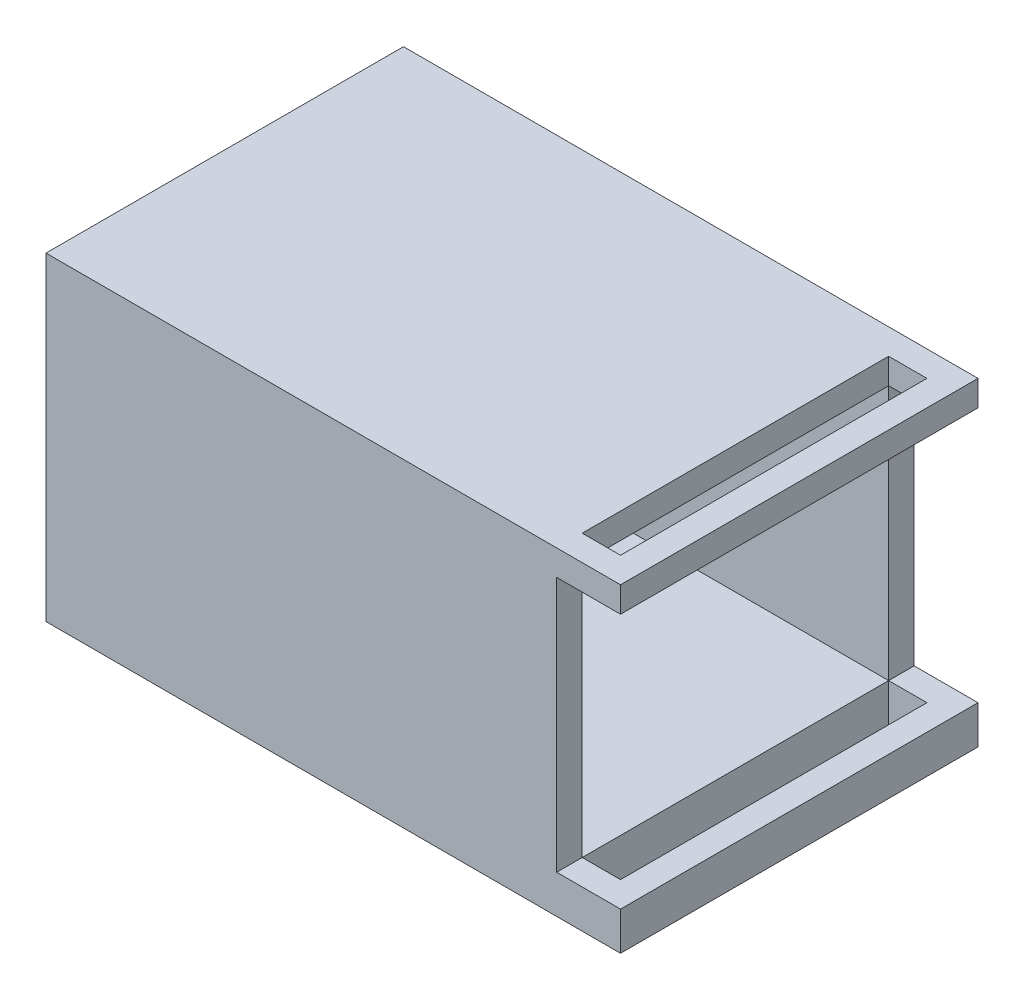
ISO-10303-21;
HEADER;
FILE_DESCRIPTION(('STEP AP214'),'2;1');
FILE_NAME('part.step','',(''),(''),'','','');
FILE_SCHEMA(('AUTOMOTIVE_DESIGN { 1 0 10303 214 1 1 1 1 }'));
ENDSEC;
DATA;
#1=APPLICATION_CONTEXT('core data for automotive mechanical design processes');
#2=APPLICATION_PROTOCOL_DEFINITION('international standard','automotive_design',2000,#1);
#3=PRODUCT_CONTEXT('',#1,'mechanical');
#4=PRODUCT('Part','Part','',(#3));
#5=PRODUCT_RELATED_PRODUCT_CATEGORY('part','',(#4));
#6=PRODUCT_DEFINITION_FORMATION('','',#4);
#7=PRODUCT_DEFINITION_CONTEXT('part definition',#1,'design');
#8=PRODUCT_DEFINITION('design','',#6,#7);
#9=PRODUCT_DEFINITION_SHAPE('','',#8);
#10=(LENGTH_UNIT() NAMED_UNIT(*) SI_UNIT(.MILLI.,.METRE.));
#11=(NAMED_UNIT(*) PLANE_ANGLE_UNIT() SI_UNIT($,.RADIAN.));
#12=(NAMED_UNIT(*) SI_UNIT($,.STERADIAN.) SOLID_ANGLE_UNIT());
#13=UNCERTAINTY_MEASURE_WITH_UNIT(LENGTH_MEASURE(1.E-05),#10,'distance_accuracy_value','');
#14=(GEOMETRIC_REPRESENTATION_CONTEXT(3) GLOBAL_UNCERTAINTY_ASSIGNED_CONTEXT((#13)) GLOBAL_UNIT_ASSIGNED_CONTEXT((#10,
#11,#12)) REPRESENTATION_CONTEXT('',''));
#15=CARTESIAN_POINT('',(0.,0.,0.));
#16=DIRECTION('',(0.,0.,1.));
#17=DIRECTION('',(1.,0.,0.));
#18=AXIS2_PLACEMENT_3D('',#15,#16,#17);
#19=CARTESIAN_POINT('',(0.,3.,0.));
#20=DIRECTION('',(0.,1.,0.));
#21=DIRECTION('',(0.,0.,1.));
#22=AXIS2_PLACEMENT_3D('',#19,#20,#21);
#23=PLANE('',#22);
#24=DIRECTION('',(0.,0.,-1.));
#25=VECTOR('',#24,1.);
#26=CARTESIAN_POINT('',(43.,3.,-2.));
#27=LINE('',#26,#25);
#28=CARTESIAN_POINT('',(43.,3.,-2.));
#29=VERTEX_POINT('',#28);
#30=CARTESIAN_POINT('',(43.,3.,-26.));
#31=VERTEX_POINT('',#30);
#32=EDGE_CURVE('E56',#29,#31,#27,.T.);
#33=ORIENTED_EDGE('',*,*,#32,.F.);
#34=DIRECTION('',(1.,0.,0.));
#35=VECTOR('',#34,1.);
#36=CARTESIAN_POINT('',(43.,3.,-2.));
#37=LINE('',#36,#35);
#38=CARTESIAN_POINT('',(40.,3.,-2.));
#39=VERTEX_POINT('',#38);
#40=EDGE_CURVE('E255',#39,#29,#37,.T.);
#41=ORIENTED_EDGE('',*,*,#40,.F.);
#42=DIRECTION('',(0.,0.,1.));
#43=VECTOR('',#42,1.);
#44=CARTESIAN_POINT('',(40.,3.,-2.));
#45=LINE('',#44,#43);
#46=CARTESIAN_POINT('',(40.,3.,0.));
#47=VERTEX_POINT('',#46);
#48=EDGE_CURVE('E443',#39,#47,#45,.T.);
#49=ORIENTED_EDGE('',*,*,#48,.T.);
#50=DIRECTION('',(1.,0.,0.));
#51=VECTOR('',#50,1.);
#52=CARTESIAN_POINT('',(0.,3.,0.));
#53=LINE('',#52,#51);
#54=CARTESIAN_POINT('',(45.,3.,0.));
#55=VERTEX_POINT('',#54);
#56=EDGE_CURVE('E471',#47,#55,#53,.T.);
#57=ORIENTED_EDGE('',*,*,#56,.T.);
#58=DIRECTION('',(0.,0.,-1.));
#59=VECTOR('',#58,1.);
#60=CARTESIAN_POINT('',(45.,3.,0.));
#61=LINE('',#60,#59);
#62=CARTESIAN_POINT('',(45.,3.,-28.));
#63=VERTEX_POINT('',#62);
#64=EDGE_CURVE('E467',#55,#63,#61,.T.);
#65=ORIENTED_EDGE('',*,*,#64,.T.);
#66=DIRECTION('',(1.,0.,0.));
#67=VECTOR('',#66,1.);
#68=CARTESIAN_POINT('',(0.,3.,-28.));
#69=LINE('',#68,#67);
#70=CARTESIAN_POINT('',(40.,3.,-28.));
#71=VERTEX_POINT('',#70);
#72=EDGE_CURVE('E465',#71,#63,#69,.T.);
#73=ORIENTED_EDGE('',*,*,#72,.F.);
#74=DIRECTION('',(0.,0.,-1.));
#75=VECTOR('',#74,1.);
#76=CARTESIAN_POINT('',(40.,3.,-26.));
#77=LINE('',#76,#75);
#78=CARTESIAN_POINT('',(40.,3.,-26.));
#79=VERTEX_POINT('',#78);
#80=EDGE_CURVE('E446',#79,#71,#77,.T.);
#81=ORIENTED_EDGE('',*,*,#80,.F.);
#82=DIRECTION('',(-1.,0.,0.));
#83=VECTOR('',#82,1.);
#84=CARTESIAN_POINT('',(43.,3.,-26.));
#85=LINE('',#84,#83);
#86=EDGE_CURVE('E264',#31,#79,#85,.T.);
#87=ORIENTED_EDGE('',*,*,#86,.F.);
#88=EDGE_LOOP('',(#33,#41,#49,#57,#65,#73,#81,#87));
#89=FACE_BOUND('',#88,.T.);
#90=ADVANCED_FACE('F41',(#89),#23,.T.);
#91=CARTESIAN_POINT('',(2.,25.,-26.));
#92=DIRECTION('',(1.,0.,0.));
#93=DIRECTION('',(0.,0.,-1.));
#94=AXIS2_PLACEMENT_3D('',#91,#92,#93);
#95=PLANE('',#94);
#96=CARTESIAN_POINT('',(2.,5.25,-17.47));
#97=DIRECTION('',(-1.,0.,0.));
#98=DIRECTION('',(0.,0.,1.));
#99=AXIS2_PLACEMENT_3D('',#96,#97,#98);
#100=CIRCLE('',#99,1.25);
#101=CARTESIAN_POINT('',(2.,5.25,-18.72));
#102=VERTEX_POINT('',#101);
#103=CARTESIAN_POINT('',(2.,4.,-17.47));
#104=VERTEX_POINT('',#103);
#105=EDGE_CURVE('E274',#102,#104,#100,.T.);
#106=ORIENTED_EDGE('',*,*,#105,.T.);
#107=DIRECTION('',(0.,0.,1.));
#108=VECTOR('',#107,1.);
#109=CARTESIAN_POINT('',(2.,4.,-17.47));
#110=LINE('',#109,#108);
#111=CARTESIAN_POINT('',(2.,4.,-10.53));
#112=VERTEX_POINT('',#111);
#113=EDGE_CURVE('E277',#104,#112,#110,.T.);
#114=ORIENTED_EDGE('',*,*,#113,.T.);
#115=CARTESIAN_POINT('',(2.,5.25,-10.53));
#116=DIRECTION('',(-1.,0.,0.));
#117=DIRECTION('',(0.,0.,1.));
#118=AXIS2_PLACEMENT_3D('',#115,#116,#117);
#119=CIRCLE('',#118,1.25);
#120=CARTESIAN_POINT('',(2.,5.25,-9.28));
#121=VERTEX_POINT('',#120);
#122=EDGE_CURVE('E281',#112,#121,#119,.T.);
#123=ORIENTED_EDGE('',*,*,#122,.T.);
#124=DIRECTION('',(0.,1.,0.));
#125=VECTOR('',#124,1.);
#126=CARTESIAN_POINT('',(2.,5.96,-9.28));
#127=LINE('',#126,#125);
#128=CARTESIAN_POINT('',(2.,5.96,-9.28));
#129=VERTEX_POINT('',#128);
#130=EDGE_CURVE('E284',#121,#129,#127,.T.);
#131=ORIENTED_EDGE('',*,*,#130,.T.);
#132=CARTESIAN_POINT('',(2.,5.96,-10.53));
#133=DIRECTION('',(-1.,0.,0.));
#134=DIRECTION('',(0.,0.,1.));
#135=AXIS2_PLACEMENT_3D('',#132,#133,#134);
#136=CIRCLE('',#135,1.25);
#137=CARTESIAN_POINT('',(2.,7.21,-10.53));
#138=VERTEX_POINT('',#137);
#139=EDGE_CURVE('E287',#129,#138,#136,.T.);
#140=ORIENTED_EDGE('',*,*,#139,.T.);
#141=DIRECTION('',(0.,0.,-1.));
#142=VECTOR('',#141,1.);
#143=CARTESIAN_POINT('',(2.,7.21,-17.47));
#144=LINE('',#143,#142);
#145=CARTESIAN_POINT('',(2.,7.21,-17.47));
#146=VERTEX_POINT('',#145);
#147=EDGE_CURVE('E290',#138,#146,#144,.T.);
#148=ORIENTED_EDGE('',*,*,#147,.T.);
#149=CARTESIAN_POINT('',(2.,5.96,-17.47));
#150=DIRECTION('',(-1.,0.,0.));
#151=DIRECTION('',(0.,0.,1.));
#152=AXIS2_PLACEMENT_3D('',#149,#150,#151);
#153=CIRCLE('',#152,1.25);
#154=CARTESIAN_POINT('',(2.,5.96,-18.72));
#155=VERTEX_POINT('',#154);
#156=EDGE_CURVE('E293',#146,#155,#153,.T.);
#157=ORIENTED_EDGE('',*,*,#156,.T.);
#158=DIRECTION('',(0.,-1.,0.));
#159=VECTOR('',#158,1.);
#160=CARTESIAN_POINT('',(2.,5.25,-18.72));
#161=LINE('',#160,#159);
#162=EDGE_CURVE('E296',#155,#102,#161,.T.);
#163=ORIENTED_EDGE('',*,*,#162,.T.);
#164=EDGE_LOOP('',(#106,#114,#123,#131,#140,#148,#157,#163));
#165=FACE_BOUND('',#164,.T.);
#166=DIRECTION('',(0.,-1.,0.));
#167=VECTOR('',#166,1.);
#168=CARTESIAN_POINT('',(2.,12.,-18.5));
#169=LINE('',#168,#167);
#170=CARTESIAN_POINT('',(2.,12.,-18.5));
#171=VERTEX_POINT('',#170);
#172=CARTESIAN_POINT('',(2.,8.5,-18.5));
#173=VERTEX_POINT('',#172);
#174=EDGE_CURVE('E353',#171,#173,#169,.T.);
#175=ORIENTED_EDGE('',*,*,#174,.T.);
#176=DIRECTION('',(0.,0.,1.));
#177=VECTOR('',#176,1.);
#178=CARTESIAN_POINT('',(2.,8.5,-18.5));
#179=LINE('',#178,#177);
#180=CARTESIAN_POINT('',(2.,8.5,-9.50000000000001));
#181=VERTEX_POINT('',#180);
#182=EDGE_CURVE('E365',#173,#181,#179,.T.);
#183=ORIENTED_EDGE('',*,*,#182,.T.);
#184=DIRECTION('',(0.,1.,0.));
#185=VECTOR('',#184,1.);
#186=CARTESIAN_POINT('',(2.,12.,-9.5));
#187=LINE('',#186,#185);
#188=CARTESIAN_POINT('',(2.,12.,-9.5));
#189=VERTEX_POINT('',#188);
#190=EDGE_CURVE('E362',#181,#189,#187,.T.);
#191=ORIENTED_EDGE('',*,*,#190,.T.);
#192=DIRECTION('',(0.,0.,-1.));
#193=VECTOR('',#192,1.);
#194=CARTESIAN_POINT('',(2.,12.,-18.5));
#195=LINE('',#194,#193);
#196=EDGE_CURVE('E343',#189,#171,#195,.T.);
#197=ORIENTED_EDGE('',*,*,#196,.T.);
#198=EDGE_LOOP('',(#175,#183,#191,#197));
#199=FACE_BOUND('',#198,.T.);
#200=DIRECTION('',(0.,-1.,0.));
#201=VECTOR('',#200,1.);
#202=CARTESIAN_POINT('',(2.,25.,-26.));
#203=LINE('',#202,#201);
#204=CARTESIAN_POINT('',(2.,23.,-26.));
#205=VERTEX_POINT('',#204);
#206=CARTESIAN_POINT('',(2.,3.,-26.));
#207=VERTEX_POINT('',#206);
#208=EDGE_CURVE('E451',#205,#207,#203,.T.);
#209=ORIENTED_EDGE('',*,*,#208,.F.);
#210=DIRECTION('',(0.,0.,1.));
#211=VECTOR('',#210,1.);
#212=CARTESIAN_POINT('',(2.,23.,-26.));
#213=LINE('',#212,#211);
#214=CARTESIAN_POINT('',(2.,23.,-2.));
#215=VERTEX_POINT('',#214);
#216=EDGE_CURVE('E420',#205,#215,#213,.T.);
#217=ORIENTED_EDGE('',*,*,#216,.T.);
#218=DIRECTION('',(0.,-1.,0.));
#219=VECTOR('',#218,1.);
#220=CARTESIAN_POINT('',(2.,25.,-2.));
#221=LINE('',#220,#219);
#222=CARTESIAN_POINT('',(2.,3.,-2.));
#223=VERTEX_POINT('',#222);
#224=EDGE_CURVE('E437',#215,#223,#221,.T.);
#225=ORIENTED_EDGE('',*,*,#224,.T.);
#226=DIRECTION('',(0.,0.,1.));
#227=VECTOR('',#226,1.);
#228=CARTESIAN_POINT('',(2.,3.,-26.));
#229=LINE('',#228,#227);
#230=EDGE_CURVE('E428',#207,#223,#229,.T.);
#231=ORIENTED_EDGE('',*,*,#230,.F.);
#232=EDGE_LOOP('',(#209,#217,#225,#231));
#233=FACE_BOUND('',#232,.T.);
#234=ADVANCED_FACE('F563',(#165,#199,#233),#95,.T.);
#235=CARTESIAN_POINT('',(2.,25.,-26.));
#236=DIRECTION('',(0.,0.,-1.));
#237=DIRECTION('',(-1.,0.,0.));
#238=AXIS2_PLACEMENT_3D('',#235,#236,#237);
#239=PLANE('',#238);
#240=DIRECTION('',(1.,0.,0.));
#241=VECTOR('',#240,1.);
#242=CARTESIAN_POINT('',(2.,23.,-26.));
#243=LINE('',#242,#241);
#244=CARTESIAN_POINT('',(40.,23.,-26.));
#245=VERTEX_POINT('',#244);
#246=EDGE_CURVE('E422',#205,#245,#243,.T.);
#247=ORIENTED_EDGE('',*,*,#246,.F.);
#248=ORIENTED_EDGE('',*,*,#208,.T.);
#249=DIRECTION('',(1.,0.,0.));
#250=VECTOR('',#249,1.);
#251=CARTESIAN_POINT('',(2.,3.,-26.));
#252=LINE('',#251,#250);
#253=EDGE_CURVE('E432',#207,#79,#252,.T.);
#254=ORIENTED_EDGE('',*,*,#253,.T.);
#255=DIRECTION('',(0.,-1.,0.));
#256=VECTOR('',#255,1.);
#257=CARTESIAN_POINT('',(40.,25.,-26.));
#258=LINE('',#257,#256);
#259=EDGE_CURVE('E454',#245,#79,#258,.T.);
#260=ORIENTED_EDGE('',*,*,#259,.F.);
#261=EDGE_LOOP('',(#247,#248,#254,#260));
#262=FACE_BOUND('',#261,.T.);
#263=ADVANCED_FACE('F525',(#262),#239,.F.);
#264=CARTESIAN_POINT('',(40.,25.,-26.));
#265=DIRECTION('',(-1.,0.,0.));
#266=DIRECTION('',(0.,0.,1.));
#267=AXIS2_PLACEMENT_3D('',#264,#265,#266);
#268=PLANE('',#267);
#269=DIRECTION('',(0.,0.,-1.));
#270=VECTOR('',#269,1.);
#271=CARTESIAN_POINT('',(40.,23.,-26.));
#272=LINE('',#271,#270);
#273=CARTESIAN_POINT('',(40.,23.,-28.));
#274=VERTEX_POINT('',#273);
#275=EDGE_CURVE('E425',#245,#274,#272,.T.);
#276=ORIENTED_EDGE('',*,*,#275,.F.);
#277=ORIENTED_EDGE('',*,*,#259,.T.);
#278=ORIENTED_EDGE('',*,*,#80,.T.);
#279=DIRECTION('',(0.,-1.,0.));
#280=VECTOR('',#279,1.);
#281=CARTESIAN_POINT('',(40.,25.,-28.));
#282=LINE('',#281,#280);
#283=EDGE_CURVE('E457',#274,#71,#282,.T.);
#284=ORIENTED_EDGE('',*,*,#283,.F.);
#285=EDGE_LOOP('',(#276,#277,#278,#284));
#286=FACE_BOUND('',#285,.T.);
#287=ADVANCED_FACE('F522',(#286),#268,.F.);
#288=CARTESIAN_POINT('',(40.,25.,-2.));
#289=DIRECTION('',(1.,0.,0.));
#290=DIRECTION('',(0.,0.,-1.));
#291=AXIS2_PLACEMENT_3D('',#288,#289,#290);
#292=PLANE('',#291);
#293=DIRECTION('',(0.,-1.,0.));
#294=VECTOR('',#293,1.);
#295=CARTESIAN_POINT('',(40.,25.,-2.));
#296=LINE('',#295,#294);
#297=CARTESIAN_POINT('',(40.,23.,-2.));
#298=VERTEX_POINT('',#297);
#299=EDGE_CURVE('E461',#298,#39,#296,.T.);
#300=ORIENTED_EDGE('',*,*,#299,.F.);
#301=DIRECTION('',(0.,0.,1.));
#302=VECTOR('',#301,1.);
#303=CARTESIAN_POINT('',(40.,23.,-2.));
#304=LINE('',#303,#302);
#305=CARTESIAN_POINT('',(40.,23.,0.));
#306=VERTEX_POINT('',#305);
#307=EDGE_CURVE('E416',#298,#306,#304,.T.);
#308=ORIENTED_EDGE('',*,*,#307,.T.);
#309=DIRECTION('',(0.,-1.,0.));
#310=VECTOR('',#309,1.);
#311=CARTESIAN_POINT('',(40.,25.,0.));
#312=LINE('',#311,#310);
#313=EDGE_CURVE('E459',#306,#47,#312,.T.);
#314=ORIENTED_EDGE('',*,*,#313,.T.);
#315=ORIENTED_EDGE('',*,*,#48,.F.);
#316=EDGE_LOOP('',(#300,#308,#314,#315));
#317=FACE_BOUND('',#316,.T.);
#318=ADVANCED_FACE('F580',(#317),#292,.T.);
#319=CARTESIAN_POINT('',(2.,25.,-2.));
#320=DIRECTION('',(0.,0.,-1.));
#321=DIRECTION('',(-1.,0.,0.));
#322=AXIS2_PLACEMENT_3D('',#319,#320,#321);
#323=PLANE('',#322);
#324=ORIENTED_EDGE('',*,*,#224,.F.);
#325=DIRECTION('',(1.,0.,0.));
#326=VECTOR('',#325,1.);
#327=CARTESIAN_POINT('',(2.,23.,-2.));
#328=LINE('',#327,#326);
#329=EDGE_CURVE('E11',#215,#298,#328,.T.);
#330=ORIENTED_EDGE('',*,*,#329,.T.);
#331=ORIENTED_EDGE('',*,*,#299,.T.);
#332=DIRECTION('',(1.,0.,0.));
#333=VECTOR('',#332,1.);
#334=CARTESIAN_POINT('',(2.,3.,-2.));
#335=LINE('',#334,#333);
#336=EDGE_CURVE('E440',#223,#39,#335,.T.);
#337=ORIENTED_EDGE('',*,*,#336,.F.);
#338=EDGE_LOOP('',(#324,#330,#331,#337));
#339=FACE_BOUND('',#338,.T.);
#340=ADVANCED_FACE('F574',(#339),#323,.T.);
#341=DIRECTION('',(0.,0.,1.));
#342=VECTOR('',#341,1.);
#343=CARTESIAN_POINT('',(40.,3.,-2.));
#344=LINE('',#343,#342);
#345=EDGE_CURVE('E258',#79,#39,#344,.T.);
#346=ORIENTED_EDGE('',*,*,#345,.F.);
#347=ORIENTED_EDGE('',*,*,#253,.F.);
#348=ORIENTED_EDGE('',*,*,#230,.T.);
#349=ORIENTED_EDGE('',*,*,#336,.T.);
#350=EDGE_LOOP('',(#346,#347,#348,#349));
#351=FACE_BOUND('',#350,.T.);
#352=ADVANCED_FACE('F565',(#351),#23,.T.);
#353=CARTESIAN_POINT('',(0.,3.,-28.));
#354=DIRECTION('',(0.,0.,-1.));
#355=DIRECTION('',(-1.,0.,0.));
#356=AXIS2_PLACEMENT_3D('',#353,#354,#355);
#357=PLANE('',#356);
#358=DIRECTION('',(-1.,0.,0.));
#359=VECTOR('',#358,1.);
#360=CARTESIAN_POINT('',(0.,23.,-28.));
#361=LINE('',#360,#359);
#362=CARTESIAN_POINT('',(45.,23.,-28.));
#363=VERTEX_POINT('',#362);
#364=EDGE_CURVE('E407',#363,#274,#361,.T.);
#365=ORIENTED_EDGE('',*,*,#364,.T.);
#366=ORIENTED_EDGE('',*,*,#283,.T.);
#367=ORIENTED_EDGE('',*,*,#72,.T.);
#368=DIRECTION('',(0.,-1.,0.));
#369=VECTOR('',#368,1.);
#370=CARTESIAN_POINT('',(45.,3.,-28.));
#371=LINE('',#370,#369);
#372=CARTESIAN_POINT('',(45.,0.,-28.));
#373=VERTEX_POINT('',#372);
#374=EDGE_CURVE('E473',#63,#373,#371,.T.);
#375=ORIENTED_EDGE('',*,*,#374,.T.);
#376=DIRECTION('',(1.,0.,0.));
#377=VECTOR('',#376,1.);
#378=CARTESIAN_POINT('',(0.,0.,-28.));
#379=LINE('',#378,#377);
#380=CARTESIAN_POINT('',(0.,0.,-28.));
#381=VERTEX_POINT('',#380);
#382=EDGE_CURVE('E453',#381,#373,#379,.T.);
#383=ORIENTED_EDGE('',*,*,#382,.F.);
#384=DIRECTION('',(0.,-1.,0.));
#385=VECTOR('',#384,1.);
#386=CARTESIAN_POINT('',(0.,3.,-28.));
#387=LINE('',#386,#385);
#388=CARTESIAN_POINT('',(0.,25.,-28.));
#389=VERTEX_POINT('',#388);
#390=EDGE_CURVE('E49',#389,#381,#387,.T.);
#391=ORIENTED_EDGE('',*,*,#390,.F.);
#392=DIRECTION('',(1.,0.,0.));
#393=VECTOR('',#392,1.);
#394=CARTESIAN_POINT('',(0.,25.,-28.));
#395=LINE('',#394,#393);
#396=CARTESIAN_POINT('',(45.,25.,-28.));
#397=VERTEX_POINT('',#396);
#398=EDGE_CURVE('E435',#389,#397,#395,.T.);
#399=ORIENTED_EDGE('',*,*,#398,.T.);
#400=DIRECTION('',(0.,1.,0.));
#401=VECTOR('',#400,1.);
#402=CARTESIAN_POINT('',(45.,23.,-28.));
#403=LINE('',#402,#401);
#404=EDGE_CURVE('E413',#363,#397,#403,.T.);
#405=ORIENTED_EDGE('',*,*,#404,.F.);
#406=EDGE_LOOP('',(#365,#366,#367,#375,#383,#391,#399,#405));
#407=FACE_BOUND('',#406,.T.);
#408=ADVANCED_FACE('F43',(#407),#357,.T.);
#409=CARTESIAN_POINT('',(0.,3.,0.));
#410=DIRECTION('',(-1.,0.,0.));
#411=DIRECTION('',(0.,0.,1.));
#412=AXIS2_PLACEMENT_3D('',#409,#410,#411);
#413=PLANE('',#412);
#414=CARTESIAN_POINT('',(0.,5.25,-17.47));
#415=DIRECTION('',(-1.,0.,0.));
#416=DIRECTION('',(0.,0.,1.));
#417=AXIS2_PLACEMENT_3D('',#414,#415,#416);
#418=CIRCLE('',#417,1.25);
#419=CARTESIAN_POINT('',(0.,5.25,-18.72));
#420=VERTEX_POINT('',#419);
#421=CARTESIAN_POINT('',(0.,4.,-17.47));
#422=VERTEX_POINT('',#421);
#423=EDGE_CURVE('E300',#420,#422,#418,.T.);
#424=ORIENTED_EDGE('',*,*,#423,.F.);
#425=DIRECTION('',(0.,-1.,0.));
#426=VECTOR('',#425,1.);
#427=CARTESIAN_POINT('',(0.,5.25,-18.72));
#428=LINE('',#427,#426);
#429=CARTESIAN_POINT('',(0.,5.96,-18.72));
#430=VERTEX_POINT('',#429);
#431=EDGE_CURVE('E278',#430,#420,#428,.T.);
#432=ORIENTED_EDGE('',*,*,#431,.F.);
#433=CARTESIAN_POINT('',(0.,5.96,-17.47));
#434=DIRECTION('',(-1.,0.,0.));
#435=DIRECTION('',(0.,0.,1.));
#436=AXIS2_PLACEMENT_3D('',#433,#434,#435);
#437=CIRCLE('',#436,1.25);
#438=CARTESIAN_POINT('',(0.,7.21,-17.47));
#439=VERTEX_POINT('',#438);
#440=EDGE_CURVE('E318',#439,#430,#437,.T.);
#441=ORIENTED_EDGE('',*,*,#440,.F.);
#442=DIRECTION('',(0.,0.,-1.));
#443=VECTOR('',#442,1.);
#444=CARTESIAN_POINT('',(0.,7.21,-17.47));
#445=LINE('',#444,#443);
#446=CARTESIAN_POINT('',(0.,7.21,-10.53));
#447=VERTEX_POINT('',#446);
#448=EDGE_CURVE('E315',#447,#439,#445,.T.);
#449=ORIENTED_EDGE('',*,*,#448,.F.);
#450=CARTESIAN_POINT('',(0.,5.96,-10.53));
#451=DIRECTION('',(-1.,0.,0.));
#452=DIRECTION('',(0.,0.,1.));
#453=AXIS2_PLACEMENT_3D('',#450,#451,#452);
#454=CIRCLE('',#453,1.25);
#455=CARTESIAN_POINT('',(0.,5.96,-9.28));
#456=VERTEX_POINT('',#455);
#457=EDGE_CURVE('E312',#456,#447,#454,.T.);
#458=ORIENTED_EDGE('',*,*,#457,.F.);
#459=DIRECTION('',(0.,1.,0.));
#460=VECTOR('',#459,1.);
#461=CARTESIAN_POINT('',(0.,5.96,-9.28));
#462=LINE('',#461,#460);
#463=CARTESIAN_POINT('',(0.,5.25,-9.28));
#464=VERTEX_POINT('',#463);
#465=EDGE_CURVE('E309',#464,#456,#462,.T.);
#466=ORIENTED_EDGE('',*,*,#465,.F.);
#467=CARTESIAN_POINT('',(0.,5.25,-10.53));
#468=DIRECTION('',(-1.,0.,0.));
#469=DIRECTION('',(0.,0.,1.));
#470=AXIS2_PLACEMENT_3D('',#467,#468,#469);
#471=CIRCLE('',#470,1.25);
#472=CARTESIAN_POINT('',(0.,4.,-10.53));
#473=VERTEX_POINT('',#472);
#474=EDGE_CURVE('E306',#473,#464,#471,.T.);
#475=ORIENTED_EDGE('',*,*,#474,.F.);
#476=DIRECTION('',(0.,0.,1.));
#477=VECTOR('',#476,1.);
#478=CARTESIAN_POINT('',(0.,4.,-17.47));
#479=LINE('',#478,#477);
#480=EDGE_CURVE('E302',#422,#473,#479,.T.);
#481=ORIENTED_EDGE('',*,*,#480,.F.);
#482=EDGE_LOOP('',(#424,#432,#441,#449,#458,#466,#475,#481));
#483=FACE_BOUND('',#482,.T.);
#484=DIRECTION('',(0.,-1.,0.));
#485=VECTOR('',#484,1.);
#486=CARTESIAN_POINT('',(0.,12.,-18.5));
#487=LINE('',#486,#485);
#488=CARTESIAN_POINT('',(0.,12.,-18.5));
#489=VERTEX_POINT('',#488);
#490=CARTESIAN_POINT('',(0.,8.5,-18.5));
#491=VERTEX_POINT('',#490);
#492=EDGE_CURVE('E303',#489,#491,#487,.T.);
#493=ORIENTED_EDGE('',*,*,#492,.F.);
#494=DIRECTION('',(0.,0.,-1.));
#495=VECTOR('',#494,1.);
#496=CARTESIAN_POINT('',(0.,12.,-18.5));
#497=LINE('',#496,#495);
#498=CARTESIAN_POINT('',(0.,12.,-9.5));
#499=VERTEX_POINT('',#498);
#500=EDGE_CURVE('E349',#499,#489,#497,.T.);
#501=ORIENTED_EDGE('',*,*,#500,.F.);
#502=DIRECTION('',(0.,1.,0.));
#503=VECTOR('',#502,1.);
#504=CARTESIAN_POINT('',(0.,12.,-9.5));
#505=LINE('',#504,#503);
#506=CARTESIAN_POINT('',(0.,8.5,-9.5));
#507=VERTEX_POINT('',#506);
#508=EDGE_CURVE('E352',#507,#499,#505,.T.);
#509=ORIENTED_EDGE('',*,*,#508,.F.);
#510=DIRECTION('',(0.,0.,1.));
#511=VECTOR('',#510,1.);
#512=CARTESIAN_POINT('',(0.,8.5,-18.5));
#513=LINE('',#512,#511);
#514=EDGE_CURVE('E356',#491,#507,#513,.T.);
#515=ORIENTED_EDGE('',*,*,#514,.F.);
#516=EDGE_LOOP('',(#493,#501,#509,#515));
#517=FACE_BOUND('',#516,.T.);
#518=ORIENTED_EDGE('',*,*,#390,.T.);
#519=DIRECTION('',(0.,0.,-1.));
#520=VECTOR('',#519,1.);
#521=CARTESIAN_POINT('',(0.,0.,0.));
#522=LINE('',#521,#520);
#523=CARTESIAN_POINT('',(0.,0.,0.));
#524=VERTEX_POINT('',#523);
#525=EDGE_CURVE('E468',#524,#381,#522,.T.);
#526=ORIENTED_EDGE('',*,*,#525,.F.);
#527=DIRECTION('',(0.,-1.,0.));
#528=VECTOR('',#527,1.);
#529=CARTESIAN_POINT('',(0.,3.,0.));
#530=LINE('',#529,#528);
#531=CARTESIAN_POINT('',(0.,25.,0.));
#532=VERTEX_POINT('',#531);
#533=EDGE_CURVE('E484',#532,#524,#530,.T.);
#534=ORIENTED_EDGE('',*,*,#533,.F.);
#535=DIRECTION('',(0.,0.,1.));
#536=VECTOR('',#535,1.);
#537=CARTESIAN_POINT('',(0.,25.,-28.));
#538=LINE('',#537,#536);
#539=EDGE_CURVE('E431',#389,#532,#538,.T.);
#540=ORIENTED_EDGE('',*,*,#539,.F.);
#541=EDGE_LOOP('',(#518,#526,#534,#540));
#542=FACE_BOUND('',#541,.T.);
#543=ADVANCED_FACE('F500',(#483,#517,#542),#413,.T.);
#544=CARTESIAN_POINT('',(0.,3.,0.));
#545=DIRECTION('',(0.,0.,-1.));
#546=DIRECTION('',(-1.,0.,0.));
#547=AXIS2_PLACEMENT_3D('',#544,#545,#546);
#548=PLANE('',#547);
#549=ORIENTED_EDGE('',*,*,#533,.T.);
#550=DIRECTION('',(1.,0.,0.));
#551=VECTOR('',#550,1.);
#552=CARTESIAN_POINT('',(0.,0.,0.));
#553=LINE('',#552,#551);
#554=CARTESIAN_POINT('',(45.,0.,0.));
#555=VERTEX_POINT('',#554);
#556=EDGE_CURVE('E479',#524,#555,#553,.T.);
#557=ORIENTED_EDGE('',*,*,#556,.T.);
#558=DIRECTION('',(0.,-1.,0.));
#559=VECTOR('',#558,1.);
#560=CARTESIAN_POINT('',(45.,3.,0.));
#561=LINE('',#560,#559);
#562=EDGE_CURVE('E486',#55,#555,#561,.T.);
#563=ORIENTED_EDGE('',*,*,#562,.F.);
#564=ORIENTED_EDGE('',*,*,#56,.F.);
#565=ORIENTED_EDGE('',*,*,#313,.F.);
#566=DIRECTION('',(1.,0.,0.));
#567=VECTOR('',#566,1.);
#568=CARTESIAN_POINT('',(0.,23.,0.));
#569=LINE('',#568,#567);
#570=CARTESIAN_POINT('',(45.,23.,0.));
#571=VERTEX_POINT('',#570);
#572=EDGE_CURVE('E402',#306,#571,#569,.T.);
#573=ORIENTED_EDGE('',*,*,#572,.T.);
#574=DIRECTION('',(0.,1.,0.));
#575=VECTOR('',#574,1.);
#576=CARTESIAN_POINT('',(45.,23.,0.));
#577=LINE('',#576,#575);
#578=CARTESIAN_POINT('',(45.,25.,0.));
#579=VERTEX_POINT('',#578);
#580=EDGE_CURVE('E410',#571,#579,#577,.T.);
#581=ORIENTED_EDGE('',*,*,#580,.T.);
#582=DIRECTION('',(1.,0.,0.));
#583=VECTOR('',#582,1.);
#584=CARTESIAN_POINT('',(0.,25.,0.));
#585=LINE('',#584,#583);
#586=EDGE_CURVE('E429',#532,#579,#585,.T.);
#587=ORIENTED_EDGE('',*,*,#586,.F.);
#588=EDGE_LOOP('',(#549,#557,#563,#564,#565,#573,#581,#587));
#589=FACE_BOUND('',#588,.T.);
#590=ADVANCED_FACE('F513',(#589),#548,.F.);
#591=CARTESIAN_POINT('',(45.,3.,0.));
#592=DIRECTION('',(-1.,0.,0.));
#593=DIRECTION('',(0.,0.,1.));
#594=AXIS2_PLACEMENT_3D('',#591,#592,#593);
#595=PLANE('',#594);
#596=DIRECTION('',(0.,0.,-1.));
#597=VECTOR('',#596,1.);
#598=CARTESIAN_POINT('',(45.,0.,0.));
#599=LINE('',#598,#597);
#600=EDGE_CURVE('E476',#555,#373,#599,.T.);
#601=ORIENTED_EDGE('',*,*,#600,.T.);
#602=ORIENTED_EDGE('',*,*,#374,.F.);
#603=ORIENTED_EDGE('',*,*,#64,.F.);
#604=ORIENTED_EDGE('',*,*,#562,.T.);
#605=EDGE_LOOP('',(#601,#602,#603,#604));
#606=FACE_BOUND('',#605,.T.);
#607=ADVANCED_FACE('F495',(#606),#595,.F.);
#608=CARTESIAN_POINT('',(0.,0.,0.));
#609=DIRECTION('',(0.,1.,0.));
#610=DIRECTION('',(0.,0.,1.));
#611=AXIS2_PLACEMENT_3D('',#608,#609,#610);
#612=PLANE('',#611);
#613=DIRECTION('',(1.,0.,0.));
#614=VECTOR('',#613,1.);
#615=CARTESIAN_POINT('',(43.,0.,-2.));
#616=LINE('',#615,#614);
#617=CARTESIAN_POINT('',(40.,0.,-2.));
#618=VERTEX_POINT('',#617);
#619=CARTESIAN_POINT('',(43.,0.,-2.));
#620=VERTEX_POINT('',#619);
#621=EDGE_CURVE('E245',#618,#620,#616,.T.);
#622=ORIENTED_EDGE('',*,*,#621,.T.);
#623=DIRECTION('',(0.,0.,-1.));
#624=VECTOR('',#623,1.);
#625=CARTESIAN_POINT('',(43.,0.,-2.));
#626=LINE('',#625,#624);
#627=CARTESIAN_POINT('',(43.,0.,-26.));
#628=VERTEX_POINT('',#627);
#629=EDGE_CURVE('E239',#620,#628,#626,.T.);
#630=ORIENTED_EDGE('',*,*,#629,.T.);
#631=DIRECTION('',(-1.,0.,0.));
#632=VECTOR('',#631,1.);
#633=CARTESIAN_POINT('',(43.,0.,-26.));
#634=LINE('',#633,#632);
#635=CARTESIAN_POINT('',(40.,0.,-26.));
#636=VERTEX_POINT('',#635);
#637=EDGE_CURVE('E248',#628,#636,#634,.T.);
#638=ORIENTED_EDGE('',*,*,#637,.T.);
#639=DIRECTION('',(0.,0.,1.));
#640=VECTOR('',#639,1.);
#641=CARTESIAN_POINT('',(40.,0.,-2.));
#642=LINE('',#641,#640);
#643=EDGE_CURVE('E64',#636,#618,#642,.T.);
#644=ORIENTED_EDGE('',*,*,#643,.T.);
#645=EDGE_LOOP('',(#622,#630,#638,#644));
#646=FACE_BOUND('',#645,.T.);
#647=ORIENTED_EDGE('',*,*,#382,.T.);
#648=ORIENTED_EDGE('',*,*,#600,.F.);
#649=ORIENTED_EDGE('',*,*,#556,.F.);
#650=ORIENTED_EDGE('',*,*,#525,.T.);
#651=EDGE_LOOP('',(#647,#648,#649,#650));
#652=FACE_BOUND('',#651,.T.);
#653=ADVANCED_FACE('F252',(#646,#652),#612,.F.);
#654=CARTESIAN_POINT('',(0.,25.,0.));
#655=DIRECTION('',(0.,1.,0.));
#656=DIRECTION('',(0.,0.,1.));
#657=AXIS2_PLACEMENT_3D('',#654,#655,#656);
#658=PLANE('',#657);
#659=DIRECTION('',(0.,0.,1.));
#660=VECTOR('',#659,1.);
#661=CARTESIAN_POINT('',(40.,25.,-26.));
#662=LINE('',#661,#660);
#663=CARTESIAN_POINT('',(40.,25.,-26.));
#664=VERTEX_POINT('',#663);
#665=CARTESIAN_POINT('',(40.,25.,-2.));
#666=VERTEX_POINT('',#665);
#667=EDGE_CURVE('E325',#664,#666,#662,.T.);
#668=ORIENTED_EDGE('',*,*,#667,.F.);
#669=DIRECTION('',(-1.,0.,0.));
#670=VECTOR('',#669,1.);
#671=CARTESIAN_POINT('',(40.,25.,-26.));
#672=LINE('',#671,#670);
#673=CARTESIAN_POINT('',(43.,25.,-26.));
#674=VERTEX_POINT('',#673);
#675=EDGE_CURVE('E374',#674,#664,#672,.T.);
#676=ORIENTED_EDGE('',*,*,#675,.F.);
#677=DIRECTION('',(0.,0.,-1.));
#678=VECTOR('',#677,1.);
#679=CARTESIAN_POINT('',(43.,25.,-26.));
#680=LINE('',#679,#678);
#681=CARTESIAN_POINT('',(43.,25.,-2.));
#682=VERTEX_POINT('',#681);
#683=EDGE_CURVE('E388',#682,#674,#680,.T.);
#684=ORIENTED_EDGE('',*,*,#683,.F.);
#685=DIRECTION('',(1.,0.,0.));
#686=VECTOR('',#685,1.);
#687=CARTESIAN_POINT('',(40.,25.,-2.));
#688=LINE('',#687,#686);
#689=EDGE_CURVE('E385',#666,#682,#688,.T.);
#690=ORIENTED_EDGE('',*,*,#689,.F.);
#691=EDGE_LOOP('',(#668,#676,#684,#690));
#692=FACE_BOUND('',#691,.T.);
#693=DIRECTION('',(0.,0.,-1.));
#694=VECTOR('',#693,1.);
#695=CARTESIAN_POINT('',(45.,25.,-28.));
#696=LINE('',#695,#694);
#697=EDGE_CURVE('E395',#579,#397,#696,.T.);
#698=ORIENTED_EDGE('',*,*,#697,.T.);
#699=ORIENTED_EDGE('',*,*,#398,.F.);
#700=ORIENTED_EDGE('',*,*,#539,.T.);
#701=ORIENTED_EDGE('',*,*,#586,.T.);
#702=EDGE_LOOP('',(#698,#699,#700,#701));
#703=FACE_BOUND('',#702,.T.);
#704=ADVANCED_FACE('F510',(#692,#703),#658,.T.);
#705=CARTESIAN_POINT('',(0.,23.,0.));
#706=DIRECTION('',(0.,1.,0.));
#707=DIRECTION('',(0.,0.,1.));
#708=AXIS2_PLACEMENT_3D('',#705,#706,#707);
#709=PLANE('',#708);
#710=DIRECTION('',(-1.,0.,0.));
#711=VECTOR('',#710,1.);
#712=CARTESIAN_POINT('',(40.,23.,-26.));
#713=LINE('',#712,#711);
#714=CARTESIAN_POINT('',(43.,23.,-26.));
#715=VERTEX_POINT('',#714);
#716=EDGE_CURVE('E380',#715,#245,#713,.T.);
#717=ORIENTED_EDGE('',*,*,#716,.T.);
#718=ORIENTED_EDGE('',*,*,#275,.T.);
#719=ORIENTED_EDGE('',*,*,#364,.F.);
#720=DIRECTION('',(0.,0.,-1.));
#721=VECTOR('',#720,1.);
#722=CARTESIAN_POINT('',(45.,23.,-28.));
#723=LINE('',#722,#721);
#724=EDGE_CURVE('E404',#571,#363,#723,.T.);
#725=ORIENTED_EDGE('',*,*,#724,.F.);
#726=ORIENTED_EDGE('',*,*,#572,.F.);
#727=ORIENTED_EDGE('',*,*,#307,.F.);
#728=DIRECTION('',(1.,0.,0.));
#729=VECTOR('',#728,1.);
#730=CARTESIAN_POINT('',(40.,23.,-2.));
#731=LINE('',#730,#729);
#732=CARTESIAN_POINT('',(43.,23.,-2.));
#733=VERTEX_POINT('',#732);
#734=EDGE_CURVE('E373',#298,#733,#731,.T.);
#735=ORIENTED_EDGE('',*,*,#734,.T.);
#736=DIRECTION('',(0.,0.,-1.));
#737=VECTOR('',#736,1.);
#738=CARTESIAN_POINT('',(43.,23.,-26.));
#739=LINE('',#738,#737);
#740=EDGE_CURVE('E377',#733,#715,#739,.T.);
#741=ORIENTED_EDGE('',*,*,#740,.T.);
#742=EDGE_LOOP('',(#717,#718,#719,#725,#726,#727,#735,#741));
#743=FACE_BOUND('',#742,.T.);
#744=ADVANCED_FACE('F517',(#743),#709,.F.);
#745=ORIENTED_EDGE('',*,*,#216,.F.);
#746=ORIENTED_EDGE('',*,*,#246,.T.);
#747=DIRECTION('',(0.,0.,1.));
#748=VECTOR('',#747,1.);
#749=CARTESIAN_POINT('',(40.,23.,-26.));
#750=LINE('',#749,#748);
#751=EDGE_CURVE('E370',#245,#298,#750,.T.);
#752=ORIENTED_EDGE('',*,*,#751,.T.);
#753=ORIENTED_EDGE('',*,*,#329,.F.);
#754=EDGE_LOOP('',(#745,#746,#752,#753));
#755=FACE_BOUND('',#754,.T.);
#756=ADVANCED_FACE('F531',(#755),#709,.F.);
#757=CARTESIAN_POINT('',(45.,23.,-28.));
#758=DIRECTION('',(1.,0.,0.));
#759=DIRECTION('',(0.,0.,-1.));
#760=AXIS2_PLACEMENT_3D('',#757,#758,#759);
#761=PLANE('',#760);
#762=ORIENTED_EDGE('',*,*,#697,.F.);
#763=ORIENTED_EDGE('',*,*,#580,.F.);
#764=ORIENTED_EDGE('',*,*,#724,.T.);
#765=ORIENTED_EDGE('',*,*,#404,.T.);
#766=EDGE_LOOP('',(#762,#763,#764,#765));
#767=FACE_BOUND('',#766,.T.);
#768=ADVANCED_FACE('F506',(#767),#761,.T.);
#769=CARTESIAN_POINT('',(40.,23.,-26.));
#770=DIRECTION('',(-1.,0.,0.));
#771=DIRECTION('',(0.,0.,1.));
#772=AXIS2_PLACEMENT_3D('',#769,#770,#771);
#773=PLANE('',#772);
#774=ORIENTED_EDGE('',*,*,#667,.T.);
#775=DIRECTION('',(0.,1.,0.));
#776=VECTOR('',#775,1.);
#777=CARTESIAN_POINT('',(40.,23.,-2.));
#778=LINE('',#777,#776);
#779=EDGE_CURVE('E383',#298,#666,#778,.T.);
#780=ORIENTED_EDGE('',*,*,#779,.F.);
#781=ORIENTED_EDGE('',*,*,#751,.F.);
#782=DIRECTION('',(0.,1.,0.));
#783=VECTOR('',#782,1.);
#784=CARTESIAN_POINT('',(40.,23.,-26.));
#785=LINE('',#784,#783);
#786=EDGE_CURVE('E393',#245,#664,#785,.T.);
#787=ORIENTED_EDGE('',*,*,#786,.T.);
#788=EDGE_LOOP('',(#774,#780,#781,#787));
#789=FACE_BOUND('',#788,.T.);
#790=ADVANCED_FACE('F541',(#789),#773,.F.);
#791=CARTESIAN_POINT('',(40.,23.,-26.));
#792=DIRECTION('',(0.,0.,-1.));
#793=DIRECTION('',(-1.,0.,0.));
#794=AXIS2_PLACEMENT_3D('',#791,#792,#793);
#795=PLANE('',#794);
#796=ORIENTED_EDGE('',*,*,#675,.T.);
#797=ORIENTED_EDGE('',*,*,#786,.F.);
#798=ORIENTED_EDGE('',*,*,#716,.F.);
#799=DIRECTION('',(0.,1.,0.));
#800=VECTOR('',#799,1.);
#801=CARTESIAN_POINT('',(43.,23.,-26.));
#802=LINE('',#801,#800);
#803=EDGE_CURVE('E396',#715,#674,#802,.T.);
#804=ORIENTED_EDGE('',*,*,#803,.T.);
#805=EDGE_LOOP('',(#796,#797,#798,#804));
#806=FACE_BOUND('',#805,.T.);
#807=ADVANCED_FACE('F536',(#806),#795,.F.);
#808=CARTESIAN_POINT('',(43.,23.,-26.));
#809=DIRECTION('',(1.,0.,0.));
#810=DIRECTION('',(0.,0.,-1.));
#811=AXIS2_PLACEMENT_3D('',#808,#809,#810);
#812=PLANE('',#811);
#813=ORIENTED_EDGE('',*,*,#683,.T.);
#814=ORIENTED_EDGE('',*,*,#803,.F.);
#815=ORIENTED_EDGE('',*,*,#740,.F.);
#816=DIRECTION('',(0.,1.,0.));
#817=VECTOR('',#816,1.);
#818=CARTESIAN_POINT('',(43.,23.,-2.));
#819=LINE('',#818,#817);
#820=EDGE_CURVE('E398',#733,#682,#819,.T.);
#821=ORIENTED_EDGE('',*,*,#820,.T.);
#822=EDGE_LOOP('',(#813,#814,#815,#821));
#823=FACE_BOUND('',#822,.T.);
#824=ADVANCED_FACE('F545',(#823),#812,.F.);
#825=CARTESIAN_POINT('',(40.,23.,-2.));
#826=DIRECTION('',(0.,0.,1.));
#827=DIRECTION('',(1.,0.,0.));
#828=AXIS2_PLACEMENT_3D('',#825,#826,#827);
#829=PLANE('',#828);
#830=ORIENTED_EDGE('',*,*,#689,.T.);
#831=ORIENTED_EDGE('',*,*,#820,.F.);
#832=ORIENTED_EDGE('',*,*,#734,.F.);
#833=ORIENTED_EDGE('',*,*,#779,.T.);
#834=EDGE_LOOP('',(#830,#831,#832,#833));
#835=FACE_BOUND('',#834,.T.);
#836=ADVANCED_FACE('F547',(#835),#829,.F.);
#837=CARTESIAN_POINT('',(2.,12.,-18.5));
#838=DIRECTION('',(0.,0.,-1.));
#839=DIRECTION('',(-1.,0.,0.));
#840=AXIS2_PLACEMENT_3D('',#837,#838,#839);
#841=PLANE('',#840);
#842=ORIENTED_EDGE('',*,*,#492,.T.);
#843=DIRECTION('',(-1.,0.,0.));
#844=VECTOR('',#843,1.);
#845=CARTESIAN_POINT('',(2.,8.5,-18.5));
#846=LINE('',#845,#844);
#847=EDGE_CURVE('E340',#173,#491,#846,.T.);
#848=ORIENTED_EDGE('',*,*,#847,.F.);
#849=ORIENTED_EDGE('',*,*,#174,.F.);
#850=DIRECTION('',(-1.,0.,0.));
#851=VECTOR('',#850,1.);
#852=CARTESIAN_POINT('',(2.,12.,-18.5));
#853=LINE('',#852,#851);
#854=EDGE_CURVE('E270',#171,#489,#853,.T.);
#855=ORIENTED_EDGE('',*,*,#854,.T.);
#856=EDGE_LOOP('',(#842,#848,#849,#855));
#857=FACE_BOUND('',#856,.T.);
#858=ADVANCED_FACE('F731',(#857),#841,.F.);
#859=CARTESIAN_POINT('',(2.,12.,-18.5));
#860=DIRECTION('',(0.,1.,0.));
#861=DIRECTION('',(0.,0.,1.));
#862=AXIS2_PLACEMENT_3D('',#859,#860,#861);
#863=PLANE('',#862);
#864=ORIENTED_EDGE('',*,*,#500,.T.);
#865=ORIENTED_EDGE('',*,*,#854,.F.);
#866=ORIENTED_EDGE('',*,*,#196,.F.);
#867=DIRECTION('',(-1.,0.,0.));
#868=VECTOR('',#867,1.);
#869=CARTESIAN_POINT('',(2.,12.,-9.5));
#870=LINE('',#869,#868);
#871=EDGE_CURVE('E346',#189,#499,#870,.T.);
#872=ORIENTED_EDGE('',*,*,#871,.T.);
#873=EDGE_LOOP('',(#864,#865,#866,#872));
#874=FACE_BOUND('',#873,.T.);
#875=ADVANCED_FACE('F739',(#874),#863,.F.);
#876=CARTESIAN_POINT('',(2.,12.,-9.5));
#877=DIRECTION('',(0.,0.,1.));
#878=DIRECTION('',(1.,0.,0.));
#879=AXIS2_PLACEMENT_3D('',#876,#877,#878);
#880=PLANE('',#879);
#881=ORIENTED_EDGE('',*,*,#508,.T.);
#882=ORIENTED_EDGE('',*,*,#871,.F.);
#883=ORIENTED_EDGE('',*,*,#190,.F.);
#884=DIRECTION('',(-1.,0.,0.));
#885=VECTOR('',#884,1.);
#886=CARTESIAN_POINT('',(2.,8.5,-9.5));
#887=LINE('',#886,#885);
#888=EDGE_CURVE('E344',#181,#507,#887,.T.);
#889=ORIENTED_EDGE('',*,*,#888,.T.);
#890=EDGE_LOOP('',(#881,#882,#883,#889));
#891=FACE_BOUND('',#890,.T.);
#892=ADVANCED_FACE('F749',(#891),#880,.F.);
#893=CARTESIAN_POINT('',(2.,8.5,-18.5));
#894=DIRECTION('',(0.,-1.,0.));
#895=DIRECTION('',(0.,0.,-1.));
#896=AXIS2_PLACEMENT_3D('',#893,#894,#895);
#897=PLANE('',#896);
#898=ORIENTED_EDGE('',*,*,#514,.T.);
#899=ORIENTED_EDGE('',*,*,#888,.F.);
#900=ORIENTED_EDGE('',*,*,#182,.F.);
#901=ORIENTED_EDGE('',*,*,#847,.T.);
#902=EDGE_LOOP('',(#898,#899,#900,#901));
#903=FACE_BOUND('',#902,.T.);
#904=ADVANCED_FACE('F759',(#903),#897,.F.);
#905=CARTESIAN_POINT('',(2.,5.25,-17.47));
#906=DIRECTION('',(-1.,0.,0.));
#907=DIRECTION('',(0.,0.,1.));
#908=AXIS2_PLACEMENT_3D('',#905,#906,#907);
#909=CYLINDRICAL_SURFACE('',#908,1.25);
#910=ORIENTED_EDGE('',*,*,#423,.T.);
#911=DIRECTION('',(-1.,0.,0.));
#912=VECTOR('',#911,1.);
#913=CARTESIAN_POINT('',(2.,4.,-17.47));
#914=LINE('',#913,#912);
#915=EDGE_CURVE('E299',#104,#422,#914,.T.);
#916=ORIENTED_EDGE('',*,*,#915,.F.);
#917=ORIENTED_EDGE('',*,*,#105,.F.);
#918=DIRECTION('',(-1.,0.,0.));
#919=VECTOR('',#918,1.);
#920=CARTESIAN_POINT('',(2.,5.25,-18.72));
#921=LINE('',#920,#919);
#922=EDGE_CURVE('E323',#102,#420,#921,.T.);
#923=ORIENTED_EDGE('',*,*,#922,.T.);
#924=EDGE_LOOP('',(#910,#916,#917,#923));
#925=FACE_BOUND('',#924,.T.);
#926=ADVANCED_FACE('F769',(#925),#909,.F.);
#927=CARTESIAN_POINT('',(2.,5.25,-18.72));
#928=DIRECTION('',(0.,0.,-1.));
#929=DIRECTION('',(-1.,0.,0.));
#930=AXIS2_PLACEMENT_3D('',#927,#928,#929);
#931=PLANE('',#930);
#932=ORIENTED_EDGE('',*,*,#431,.T.);
#933=ORIENTED_EDGE('',*,*,#922,.F.);
#934=ORIENTED_EDGE('',*,*,#162,.F.);
#935=DIRECTION('',(-1.,0.,0.));
#936=VECTOR('',#935,1.);
#937=CARTESIAN_POINT('',(2.,5.96,-18.72));
#938=LINE('',#937,#936);
#939=EDGE_CURVE('E326',#155,#430,#938,.T.);
#940=ORIENTED_EDGE('',*,*,#939,.T.);
#941=EDGE_LOOP('',(#932,#933,#934,#940));
#942=FACE_BOUND('',#941,.T.);
#943=ADVANCED_FACE('F779',(#942),#931,.F.);
#944=CARTESIAN_POINT('',(2.,5.96,-17.47));
#945=DIRECTION('',(-1.,0.,0.));
#946=DIRECTION('',(0.,0.,1.));
#947=AXIS2_PLACEMENT_3D('',#944,#945,#946);
#948=CYLINDRICAL_SURFACE('',#947,1.25);
#949=ORIENTED_EDGE('',*,*,#440,.T.);
#950=ORIENTED_EDGE('',*,*,#939,.F.);
#951=ORIENTED_EDGE('',*,*,#156,.F.);
#952=DIRECTION('',(-1.,0.,0.));
#953=VECTOR('',#952,1.);
#954=CARTESIAN_POINT('',(2.,7.21,-17.47));
#955=LINE('',#954,#953);
#956=EDGE_CURVE('E328',#146,#439,#955,.T.);
#957=ORIENTED_EDGE('',*,*,#956,.T.);
#958=EDGE_LOOP('',(#949,#950,#951,#957));
#959=FACE_BOUND('',#958,.T.);
#960=ADVANCED_FACE('F789',(#959),#948,.F.);
#961=CARTESIAN_POINT('',(2.,7.21,-17.47));
#962=DIRECTION('',(0.,1.,0.));
#963=DIRECTION('',(0.,0.,1.));
#964=AXIS2_PLACEMENT_3D('',#961,#962,#963);
#965=PLANE('',#964);
#966=ORIENTED_EDGE('',*,*,#448,.T.);
#967=ORIENTED_EDGE('',*,*,#956,.F.);
#968=ORIENTED_EDGE('',*,*,#147,.F.);
#969=DIRECTION('',(-1.,0.,0.));
#970=VECTOR('',#969,1.);
#971=CARTESIAN_POINT('',(2.,7.21,-10.53));
#972=LINE('',#971,#970);
#973=EDGE_CURVE('E330',#138,#447,#972,.T.);
#974=ORIENTED_EDGE('',*,*,#973,.T.);
#975=EDGE_LOOP('',(#966,#967,#968,#974));
#976=FACE_BOUND('',#975,.T.);
#977=ADVANCED_FACE('F799',(#976),#965,.F.);
#978=CARTESIAN_POINT('',(2.,5.96,-10.53));
#979=DIRECTION('',(-1.,0.,0.));
#980=DIRECTION('',(0.,0.,1.));
#981=AXIS2_PLACEMENT_3D('',#978,#979,#980);
#982=CYLINDRICAL_SURFACE('',#981,1.25);
#983=ORIENTED_EDGE('',*,*,#457,.T.);
#984=ORIENTED_EDGE('',*,*,#973,.F.);
#985=ORIENTED_EDGE('',*,*,#139,.F.);
#986=DIRECTION('',(-1.,0.,0.));
#987=VECTOR('',#986,1.);
#988=CARTESIAN_POINT('',(2.,5.96,-9.28));
#989=LINE('',#988,#987);
#990=EDGE_CURVE('E332',#129,#456,#989,.T.);
#991=ORIENTED_EDGE('',*,*,#990,.T.);
#992=EDGE_LOOP('',(#983,#984,#985,#991));
#993=FACE_BOUND('',#992,.T.);
#994=ADVANCED_FACE('F809',(#993),#982,.F.);
#995=CARTESIAN_POINT('',(2.,5.96,-9.28));
#996=DIRECTION('',(0.,0.,1.));
#997=DIRECTION('',(0.,-1.,0.));
#998=AXIS2_PLACEMENT_3D('',#995,#996,#997);
#999=PLANE('',#998);
#1000=ORIENTED_EDGE('',*,*,#465,.T.);
#1001=ORIENTED_EDGE('',*,*,#990,.F.);
#1002=ORIENTED_EDGE('',*,*,#130,.F.);
#1003=DIRECTION('',(-1.,0.,0.));
#1004=VECTOR('',#1003,1.);
#1005=CARTESIAN_POINT('',(2.,5.25,-9.28));
#1006=LINE('',#1005,#1004);
#1007=EDGE_CURVE('E334',#121,#464,#1006,.T.);
#1008=ORIENTED_EDGE('',*,*,#1007,.T.);
#1009=EDGE_LOOP('',(#1000,#1001,#1002,#1008));
#1010=FACE_BOUND('',#1009,.T.);
#1011=ADVANCED_FACE('F819',(#1010),#999,.F.);
#1012=CARTESIAN_POINT('',(2.,5.25,-10.53));
#1013=DIRECTION('',(-1.,0.,0.));
#1014=DIRECTION('',(0.,0.,1.));
#1015=AXIS2_PLACEMENT_3D('',#1012,#1013,#1014);
#1016=CYLINDRICAL_SURFACE('',#1015,1.25);
#1017=ORIENTED_EDGE('',*,*,#474,.T.);
#1018=ORIENTED_EDGE('',*,*,#1007,.F.);
#1019=ORIENTED_EDGE('',*,*,#122,.F.);
#1020=DIRECTION('',(-1.,0.,0.));
#1021=VECTOR('',#1020,1.);
#1022=CARTESIAN_POINT('',(2.,4.,-10.53));
#1023=LINE('',#1022,#1021);
#1024=EDGE_CURVE('E336',#112,#473,#1023,.T.);
#1025=ORIENTED_EDGE('',*,*,#1024,.T.);
#1026=EDGE_LOOP('',(#1017,#1018,#1019,#1025));
#1027=FACE_BOUND('',#1026,.T.);
#1028=ADVANCED_FACE('F829',(#1027),#1016,.F.);
#1029=CARTESIAN_POINT('',(2.,4.,-17.47));
#1030=DIRECTION('',(0.,-1.,0.));
#1031=DIRECTION('',(0.,0.,-1.));
#1032=AXIS2_PLACEMENT_3D('',#1029,#1030,#1031);
#1033=PLANE('',#1032);
#1034=ORIENTED_EDGE('',*,*,#480,.T.);
#1035=ORIENTED_EDGE('',*,*,#1024,.F.);
#1036=ORIENTED_EDGE('',*,*,#113,.F.);
#1037=ORIENTED_EDGE('',*,*,#915,.T.);
#1038=EDGE_LOOP('',(#1034,#1035,#1036,#1037));
#1039=FACE_BOUND('',#1038,.T.);
#1040=ADVANCED_FACE('F839',(#1039),#1033,.F.);
#1041=CARTESIAN_POINT('',(43.,0.,-2.));
#1042=DIRECTION('',(1.,0.,0.));
#1043=DIRECTION('',(0.,0.,-1.));
#1044=AXIS2_PLACEMENT_3D('',#1041,#1042,#1043);
#1045=PLANE('',#1044);
#1046=ORIENTED_EDGE('',*,*,#32,.T.);
#1047=DIRECTION('',(0.,1.,0.));
#1048=VECTOR('',#1047,1.);
#1049=CARTESIAN_POINT('',(43.,0.,-26.));
#1050=LINE('',#1049,#1048);
#1051=EDGE_CURVE('E235',#628,#31,#1050,.T.);
#1052=ORIENTED_EDGE('',*,*,#1051,.F.);
#1053=ORIENTED_EDGE('',*,*,#629,.F.);
#1054=DIRECTION('',(0.,1.,0.));
#1055=VECTOR('',#1054,1.);
#1056=CARTESIAN_POINT('',(43.,0.,-2.));
#1057=LINE('',#1056,#1055);
#1058=EDGE_CURVE('E268',#620,#29,#1057,.T.);
#1059=ORIENTED_EDGE('',*,*,#1058,.T.);
#1060=EDGE_LOOP('',(#1046,#1052,#1053,#1059));
#1061=FACE_BOUND('',#1060,.T.);
#1062=ADVANCED_FACE('F237',(#1061),#1045,.F.);
#1063=CARTESIAN_POINT('',(43.,0.,-2.));
#1064=DIRECTION('',(0.,0.,1.));
#1065=DIRECTION('',(1.,0.,0.));
#1066=AXIS2_PLACEMENT_3D('',#1063,#1064,#1065);
#1067=PLANE('',#1066);
#1068=ORIENTED_EDGE('',*,*,#40,.T.);
#1069=ORIENTED_EDGE('',*,*,#1058,.F.);
#1070=ORIENTED_EDGE('',*,*,#621,.F.);
#1071=DIRECTION('',(0.,1.,0.));
#1072=VECTOR('',#1071,1.);
#1073=CARTESIAN_POINT('',(40.,0.,-2.));
#1074=LINE('',#1073,#1072);
#1075=EDGE_CURVE('E271',#618,#39,#1074,.T.);
#1076=ORIENTED_EDGE('',*,*,#1075,.T.);
#1077=EDGE_LOOP('',(#1068,#1069,#1070,#1076));
#1078=FACE_BOUND('',#1077,.T.);
#1079=ADVANCED_FACE('F861',(#1078),#1067,.F.);
#1080=CARTESIAN_POINT('',(40.,0.,-2.));
#1081=DIRECTION('',(-1.,0.,0.));
#1082=DIRECTION('',(0.,0.,1.));
#1083=AXIS2_PLACEMENT_3D('',#1080,#1081,#1082);
#1084=PLANE('',#1083);
#1085=ORIENTED_EDGE('',*,*,#345,.T.);
#1086=ORIENTED_EDGE('',*,*,#1075,.F.);
#1087=ORIENTED_EDGE('',*,*,#643,.F.);
#1088=DIRECTION('',(0.,1.,0.));
#1089=VECTOR('',#1088,1.);
#1090=CARTESIAN_POINT('',(40.,0.,-26.));
#1091=LINE('',#1090,#1089);
#1092=EDGE_CURVE('E244',#636,#79,#1091,.T.);
#1093=ORIENTED_EDGE('',*,*,#1092,.T.);
#1094=EDGE_LOOP('',(#1085,#1086,#1087,#1093));
#1095=FACE_BOUND('',#1094,.T.);
#1096=ADVANCED_FACE('F588',(#1095),#1084,.F.);
#1097=CARTESIAN_POINT('',(43.,0.,-26.));
#1098=DIRECTION('',(0.,0.,-1.));
#1099=DIRECTION('',(-1.,0.,0.));
#1100=AXIS2_PLACEMENT_3D('',#1097,#1098,#1099);
#1101=PLANE('',#1100);
#1102=ORIENTED_EDGE('',*,*,#86,.T.);
#1103=ORIENTED_EDGE('',*,*,#1092,.F.);
#1104=ORIENTED_EDGE('',*,*,#637,.F.);
#1105=ORIENTED_EDGE('',*,*,#1051,.T.);
#1106=EDGE_LOOP('',(#1102,#1103,#1104,#1105));
#1107=FACE_BOUND('',#1106,.T.);
#1108=ADVANCED_FACE('F249',(#1107),#1101,.F.);
#1109=CLOSED_SHELL('',(#90,#234,#263,#287,#318,#340,#352,#408,#543,#590,#607,#653,#704,#744,
#756,#768,#790,#807,#824,#836,#858,#875,#892,#904,#926,#943,#960,#977,#994,#1011,#1028,#1040,
#1062,#1079,#1096,#1108));
#1110=MANIFOLD_SOLID_BREP('B2',#1109);
#1111=ADVANCED_BREP_SHAPE_REPRESENTATION('',(#18,#1110),#14);
#1112=SHAPE_DEFINITION_REPRESENTATION(#9,#1111);
ENDSEC;
END-ISO-10303-21;
